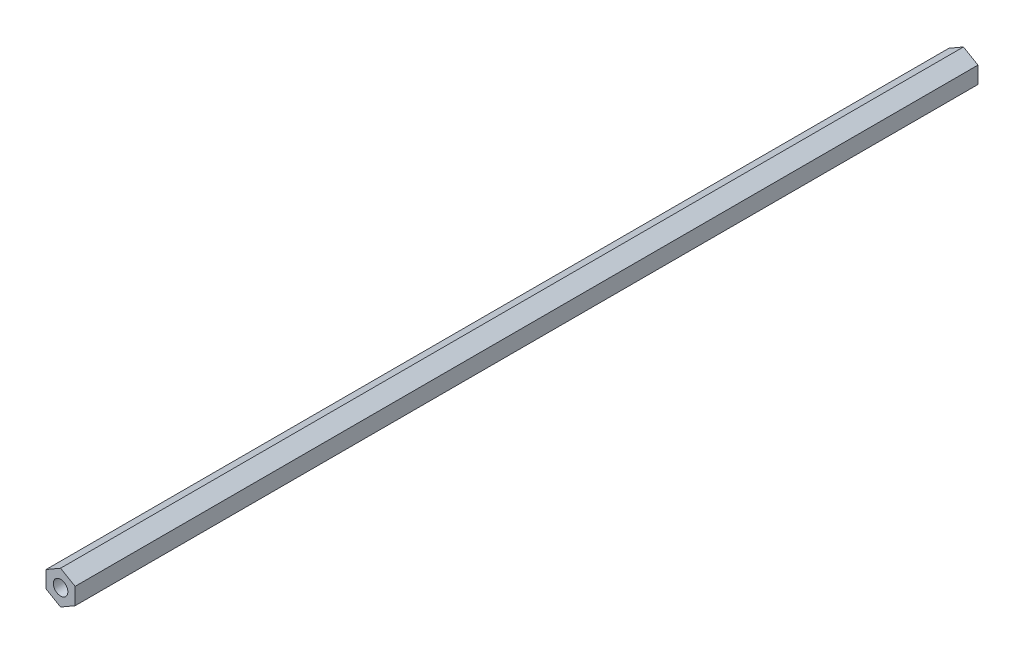
ISO-10303-21;
HEADER;
FILE_DESCRIPTION(('STEP AP214'),'2;1');
FILE_NAME('part.step','',(''),(''),'','','');
FILE_SCHEMA(('AUTOMOTIVE_DESIGN { 1 0 10303 214 1 1 1 1 }'));
ENDSEC;
DATA;
#1=APPLICATION_CONTEXT('core data for automotive mechanical design processes');
#2=APPLICATION_PROTOCOL_DEFINITION('international standard','automotive_design',2000,#1);
#3=PRODUCT_CONTEXT('',#1,'mechanical');
#4=PRODUCT('Part','Part','',(#3));
#5=PRODUCT_RELATED_PRODUCT_CATEGORY('part','',(#4));
#6=PRODUCT_DEFINITION_FORMATION('','',#4);
#7=PRODUCT_DEFINITION_CONTEXT('part definition',#1,'design');
#8=PRODUCT_DEFINITION('design','',#6,#7);
#9=PRODUCT_DEFINITION_SHAPE('','',#8);
#10=(LENGTH_UNIT() NAMED_UNIT(*) SI_UNIT(.MILLI.,.METRE.));
#11=(NAMED_UNIT(*) PLANE_ANGLE_UNIT() SI_UNIT($,.RADIAN.));
#12=(NAMED_UNIT(*) SI_UNIT($,.STERADIAN.) SOLID_ANGLE_UNIT());
#13=UNCERTAINTY_MEASURE_WITH_UNIT(LENGTH_MEASURE(1.E-05),#10,'distance_accuracy_value','');
#14=(GEOMETRIC_REPRESENTATION_CONTEXT(3) GLOBAL_UNCERTAINTY_ASSIGNED_CONTEXT((#13)) GLOBAL_UNIT_ASSIGNED_CONTEXT((#10,
#11,#12)) REPRESENTATION_CONTEXT('',''));
#15=CARTESIAN_POINT('',(0.,0.,0.));
#16=DIRECTION('',(0.,0.,1.));
#17=DIRECTION('',(1.,0.,0.));
#18=AXIS2_PLACEMENT_3D('',#15,#16,#17);
#19=CARTESIAN_POINT('',(-6.35,3.66617420935411,196.85));
#20=DIRECTION('',(1.,0.,0.));
#21=DIRECTION('',(0.,0.,-1.));
#22=AXIS2_PLACEMENT_3D('',#19,#20,#21);
#23=PLANE('',#22);
#24=DIRECTION('',(0.,0.,-1.));
#25=VECTOR('',#24,1.);
#26=CARTESIAN_POINT('',(-6.35,3.66617420935411,196.85));
#27=LINE('',#26,#25);
#28=CARTESIAN_POINT('',(-6.35,3.66617420935411,196.85));
#29=VERTEX_POINT('',#28);
#30=CARTESIAN_POINT('',(-6.35,3.66617420935411,-196.85));
#31=VERTEX_POINT('',#30);
#32=EDGE_CURVE('E142',#29,#31,#27,.T.);
#33=ORIENTED_EDGE('',*,*,#32,.T.);
#34=DIRECTION('',(0.,-1.,0.));
#35=VECTOR('',#34,1.);
#36=CARTESIAN_POINT('',(-6.35,3.66617420935411,-196.85));
#37=LINE('',#36,#35);
#38=CARTESIAN_POINT('',(-6.35,-3.66617420935413,-196.85));
#39=VERTEX_POINT('',#38);
#40=EDGE_CURVE('E114',#31,#39,#37,.T.);
#41=ORIENTED_EDGE('',*,*,#40,.T.);
#42=DIRECTION('',(0.,0.,-1.));
#43=VECTOR('',#42,1.);
#44=CARTESIAN_POINT('',(-6.35,-3.66617420935413,196.85));
#45=LINE('',#44,#43);
#46=CARTESIAN_POINT('',(-6.35,-3.66617420935413,196.85));
#47=VERTEX_POINT('',#46);
#48=EDGE_CURVE('E11',#47,#39,#45,.T.);
#49=ORIENTED_EDGE('',*,*,#48,.F.);
#50=DIRECTION('',(0.,-1.,0.));
#51=VECTOR('',#50,1.);
#52=CARTESIAN_POINT('',(-6.35,3.66617420935411,196.85));
#53=LINE('',#52,#51);
#54=EDGE_CURVE('E132',#29,#47,#53,.T.);
#55=ORIENTED_EDGE('',*,*,#54,.F.);
#56=EDGE_LOOP('',(#33,#41,#49,#55));
#57=FACE_BOUND('',#56,.T.);
#58=ADVANCED_FACE('F38',(#57),#23,.F.);
#59=CARTESIAN_POINT('',(-6.35,-3.66617420935413,196.85));
#60=DIRECTION('',(0.5,0.866025403784438,0.));
#61=DIRECTION('',(-0.866025403784439,0.5,0.));
#62=AXIS2_PLACEMENT_3D('',#59,#60,#61);
#63=PLANE('',#62);
#64=ORIENTED_EDGE('',*,*,#48,.T.);
#65=DIRECTION('',(0.866025403784439,-0.5,0.));
#66=VECTOR('',#65,1.);
#67=CARTESIAN_POINT('',(-6.35,-3.66617420935413,-196.85));
#68=LINE('',#67,#66);
#69=CARTESIAN_POINT('',(0.,-7.33234841870826,-196.85));
#70=VERTEX_POINT('',#69);
#71=EDGE_CURVE('E117',#39,#70,#68,.T.);
#72=ORIENTED_EDGE('',*,*,#71,.T.);
#73=DIRECTION('',(0.,0.,-1.));
#74=VECTOR('',#73,1.);
#75=CARTESIAN_POINT('',(0.,-7.33234841870826,196.85));
#76=LINE('',#75,#74);
#77=CARTESIAN_POINT('',(0.,-7.33234841870826,196.85));
#78=VERTEX_POINT('',#77);
#79=EDGE_CURVE('E45',#78,#70,#76,.T.);
#80=ORIENTED_EDGE('',*,*,#79,.F.);
#81=DIRECTION('',(0.866025403784439,-0.5,0.));
#82=VECTOR('',#81,1.);
#83=CARTESIAN_POINT('',(-6.35,-3.66617420935413,196.85));
#84=LINE('',#83,#82);
#85=EDGE_CURVE('E134',#47,#78,#84,.T.);
#86=ORIENTED_EDGE('',*,*,#85,.F.);
#87=EDGE_LOOP('',(#64,#72,#80,#86));
#88=FACE_BOUND('',#87,.T.);
#89=ADVANCED_FACE('F162',(#88),#63,.F.);
#90=CARTESIAN_POINT('',(0.,-7.33234841870826,196.85));
#91=DIRECTION('',(-0.5,0.866025403784439,0.));
#92=DIRECTION('',(-0.866025403784439,-0.5,0.));
#93=AXIS2_PLACEMENT_3D('',#90,#91,#92);
#94=PLANE('',#93);
#95=ORIENTED_EDGE('',*,*,#79,.T.);
#96=DIRECTION('',(0.866025403784439,0.5,0.));
#97=VECTOR('',#96,1.);
#98=CARTESIAN_POINT('',(0.,-7.33234841870826,-196.85));
#99=LINE('',#98,#97);
#100=CARTESIAN_POINT('',(6.35,-3.66617420935414,-196.85));
#101=VERTEX_POINT('',#100);
#102=EDGE_CURVE('E120',#70,#101,#99,.T.);
#103=ORIENTED_EDGE('',*,*,#102,.T.);
#104=DIRECTION('',(0.,0.,-1.));
#105=VECTOR('',#104,1.);
#106=CARTESIAN_POINT('',(6.35,-3.66617420935414,196.85));
#107=LINE('',#106,#105);
#108=CARTESIAN_POINT('',(6.35,-3.66617420935414,196.85));
#109=VERTEX_POINT('',#108);
#110=EDGE_CURVE('E148',#109,#101,#107,.T.);
#111=ORIENTED_EDGE('',*,*,#110,.F.);
#112=DIRECTION('',(0.866025403784439,0.5,0.));
#113=VECTOR('',#112,1.);
#114=CARTESIAN_POINT('',(0.,-7.33234841870826,196.85));
#115=LINE('',#114,#113);
#116=EDGE_CURVE('E136',#78,#109,#115,.T.);
#117=ORIENTED_EDGE('',*,*,#116,.F.);
#118=EDGE_LOOP('',(#95,#103,#111,#117));
#119=FACE_BOUND('',#118,.T.);
#120=ADVANCED_FACE('F153',(#119),#94,.F.);
#121=CARTESIAN_POINT('',(6.35,-3.66617420935414,196.85));
#122=DIRECTION('',(-1.,0.,0.));
#123=DIRECTION('',(0.,-1.,0.));
#124=AXIS2_PLACEMENT_3D('',#121,#122,#123);
#125=PLANE('',#124);
#126=ORIENTED_EDGE('',*,*,#110,.T.);
#127=DIRECTION('',(0.,1.,0.));
#128=VECTOR('',#127,1.);
#129=CARTESIAN_POINT('',(6.35,-3.66617420935414,-196.85));
#130=LINE('',#129,#128);
#131=CARTESIAN_POINT('',(6.35,3.66617420935412,-196.85));
#132=VERTEX_POINT('',#131);
#133=EDGE_CURVE('E123',#101,#132,#130,.T.);
#134=ORIENTED_EDGE('',*,*,#133,.T.);
#135=DIRECTION('',(0.,0.,-1.));
#136=VECTOR('',#135,1.);
#137=CARTESIAN_POINT('',(6.35,3.66617420935412,196.85));
#138=LINE('',#137,#136);
#139=CARTESIAN_POINT('',(6.35,3.66617420935412,196.85));
#140=VERTEX_POINT('',#139);
#141=EDGE_CURVE('E146',#140,#132,#138,.T.);
#142=ORIENTED_EDGE('',*,*,#141,.F.);
#143=DIRECTION('',(0.,1.,0.));
#144=VECTOR('',#143,1.);
#145=CARTESIAN_POINT('',(6.35,-3.66617420935414,196.85));
#146=LINE('',#145,#144);
#147=EDGE_CURVE('E138',#109,#140,#146,.T.);
#148=ORIENTED_EDGE('',*,*,#147,.F.);
#149=EDGE_LOOP('',(#126,#134,#142,#148));
#150=FACE_BOUND('',#149,.T.);
#151=ADVANCED_FACE('F173',(#150),#125,.F.);
#152=CARTESIAN_POINT('',(6.35,3.66617420935412,196.85));
#153=DIRECTION('',(-0.5,-0.866025403784438,0.));
#154=DIRECTION('',(0.866025403784439,-0.5,0.));
#155=AXIS2_PLACEMENT_3D('',#152,#153,#154);
#156=PLANE('',#155);
#157=ORIENTED_EDGE('',*,*,#141,.T.);
#158=DIRECTION('',(-0.866025403784439,0.5,0.));
#159=VECTOR('',#158,1.);
#160=CARTESIAN_POINT('',(6.35,3.66617420935412,-196.85));
#161=LINE('',#160,#159);
#162=CARTESIAN_POINT('',(0.,7.33234841870824,-196.85));
#163=VERTEX_POINT('',#162);
#164=EDGE_CURVE('E126',#132,#163,#161,.T.);
#165=ORIENTED_EDGE('',*,*,#164,.T.);
#166=DIRECTION('',(0.,0.,-1.));
#167=VECTOR('',#166,1.);
#168=CARTESIAN_POINT('',(0.,7.33234841870824,196.85));
#169=LINE('',#168,#167);
#170=CARTESIAN_POINT('',(0.,7.33234841870824,196.85));
#171=VERTEX_POINT('',#170);
#172=EDGE_CURVE('E144',#171,#163,#169,.T.);
#173=ORIENTED_EDGE('',*,*,#172,.F.);
#174=DIRECTION('',(-0.866025403784439,0.5,0.));
#175=VECTOR('',#174,1.);
#176=CARTESIAN_POINT('',(6.35,3.66617420935412,196.85));
#177=LINE('',#176,#175);
#178=EDGE_CURVE('E57',#140,#171,#177,.T.);
#179=ORIENTED_EDGE('',*,*,#178,.F.);
#180=EDGE_LOOP('',(#157,#165,#173,#179));
#181=FACE_BOUND('',#180,.T.);
#182=ADVANCED_FACE('F170',(#181),#156,.F.);
#183=CARTESIAN_POINT('',(0.,7.33234841870824,196.85));
#184=DIRECTION('',(0.5,-0.866025403784439,0.));
#185=DIRECTION('',(0.866025403784439,0.5,0.));
#186=AXIS2_PLACEMENT_3D('',#183,#184,#185);
#187=PLANE('',#186);
#188=ORIENTED_EDGE('',*,*,#172,.T.);
#189=DIRECTION('',(-0.866025403784439,-0.5,0.));
#190=VECTOR('',#189,1.);
#191=CARTESIAN_POINT('',(0.,7.33234841870824,-196.85));
#192=LINE('',#191,#190);
#193=EDGE_CURVE('E129',#163,#31,#192,.T.);
#194=ORIENTED_EDGE('',*,*,#193,.T.);
#195=ORIENTED_EDGE('',*,*,#32,.F.);
#196=DIRECTION('',(-0.866025403784439,-0.5,0.));
#197=VECTOR('',#196,1.);
#198=CARTESIAN_POINT('',(0.,7.33234841870824,196.85));
#199=LINE('',#198,#197);
#200=EDGE_CURVE('E52',#171,#29,#199,.T.);
#201=ORIENTED_EDGE('',*,*,#200,.F.);
#202=EDGE_LOOP('',(#188,#194,#195,#201));
#203=FACE_BOUND('',#202,.T.);
#204=ADVANCED_FACE('F168',(#203),#187,.F.);
#205=CARTESIAN_POINT('',(0.,0.,196.85));
#206=DIRECTION('',(0.,0.,1.));
#207=DIRECTION('',(1.,0.,0.));
#208=AXIS2_PLACEMENT_3D('',#205,#206,#207);
#209=PLANE('',#208);
#210=CARTESIAN_POINT('',(0.,0.,196.85));
#211=DIRECTION('',(0.,0.,1.));
#212=DIRECTION('',(1.,0.,0.));
#213=AXIS2_PLACEMENT_3D('',#210,#211,#212);
#214=CIRCLE('',#213,3.17499999999999);
#215=CARTESIAN_POINT('',(3.17499999999999,0.,196.85));
#216=VERTEX_POINT('',#215);
#217=EDGE_CURVE('E103',#216,#216,#214,.T.);
#218=ORIENTED_EDGE('',*,*,#217,.F.);
#219=EDGE_LOOP('',(#218));
#220=FACE_BOUND('',#219,.T.);
#221=ORIENTED_EDGE('',*,*,#54,.T.);
#222=ORIENTED_EDGE('',*,*,#85,.T.);
#223=ORIENTED_EDGE('',*,*,#116,.T.);
#224=ORIENTED_EDGE('',*,*,#147,.T.);
#225=ORIENTED_EDGE('',*,*,#178,.T.);
#226=ORIENTED_EDGE('',*,*,#200,.T.);
#227=EDGE_LOOP('',(#221,#222,#223,#224,#225,#226));
#228=FACE_BOUND('',#227,.T.);
#229=ADVANCED_FACE('F175',(#220,#228),#209,.T.);
#230=CARTESIAN_POINT('',(0.,0.,-196.85));
#231=DIRECTION('',(0.,0.,1.));
#232=DIRECTION('',(1.,0.,0.));
#233=AXIS2_PLACEMENT_3D('',#230,#231,#232);
#234=PLANE('',#233);
#235=CARTESIAN_POINT('',(0.,0.,-196.85));
#236=DIRECTION('',(0.,0.,-1.));
#237=DIRECTION('',(-1.,0.,0.));
#238=AXIS2_PLACEMENT_3D('',#235,#236,#237);
#239=CIRCLE('',#238,3.17499999999999);
#240=CARTESIAN_POINT('',(-3.17499999999999,0.,-196.85));
#241=VERTEX_POINT('',#240);
#242=EDGE_CURVE('E104',#241,#241,#239,.T.);
#243=ORIENTED_EDGE('',*,*,#242,.F.);
#244=EDGE_LOOP('',(#243));
#245=FACE_BOUND('',#244,.T.);
#246=ORIENTED_EDGE('',*,*,#40,.F.);
#247=ORIENTED_EDGE('',*,*,#193,.F.);
#248=ORIENTED_EDGE('',*,*,#164,.F.);
#249=ORIENTED_EDGE('',*,*,#133,.F.);
#250=ORIENTED_EDGE('',*,*,#102,.F.);
#251=ORIENTED_EDGE('',*,*,#71,.F.);
#252=EDGE_LOOP('',(#246,#247,#248,#249,#250,#251));
#253=FACE_BOUND('',#252,.T.);
#254=ADVANCED_FACE('F160',(#245,#253),#234,.F.);
#255=CARTESIAN_POINT('',(0.,0.,171.45));
#256=DIRECTION('',(0.,0.,1.));
#257=DIRECTION('',(1.,0.,0.));
#258=AXIS2_PLACEMENT_3D('',#255,#256,#257);
#259=CONICAL_SURFACE('',#258,3.17499999999995,1.02974425867665);
#260=CARTESIAN_POINT('',(0.,0.,169.542267534588));
#261=VERTEX_POINT('',#260);
#262=VERTEX_LOOP('',#261);
#263=FACE_BOUND('',#262,.T.);
#264=CARTESIAN_POINT('',(0.,0.,171.45));
#265=DIRECTION('',(0.,0.,1.));
#266=DIRECTION('',(1.,0.,0.));
#267=AXIS2_PLACEMENT_3D('',#264,#265,#266);
#268=CIRCLE('',#267,3.17499999999995);
#269=CARTESIAN_POINT('',(3.17499999999995,0.,171.45));
#270=VERTEX_POINT('',#269);
#271=EDGE_CURVE('E107',#270,#270,#268,.T.);
#272=ORIENTED_EDGE('',*,*,#271,.T.);
#273=EDGE_LOOP('',(#272));
#274=FACE_BOUND('',#273,.T.);
#275=ADVANCED_FACE('F183',(#263,#274),#259,.F.);
#276=CARTESIAN_POINT('',(0.,0.,196.85));
#277=DIRECTION('',(0.,0.,1.));
#278=DIRECTION('',(1.,0.,0.));
#279=AXIS2_PLACEMENT_3D('',#276,#277,#278);
#280=CYLINDRICAL_SURFACE('',#279,3.17499999999997);
#281=ORIENTED_EDGE('',*,*,#271,.F.);
#282=EDGE_LOOP('',(#281));
#283=FACE_BOUND('',#282,.T.);
#284=ORIENTED_EDGE('',*,*,#217,.T.);
#285=EDGE_LOOP('',(#284));
#286=FACE_BOUND('',#285,.T.);
#287=ADVANCED_FACE('F97',(#283,#286),#280,.F.);
#288=CARTESIAN_POINT('',(0.,0.,-171.45));
#289=DIRECTION('',(0.,0.,-1.));
#290=DIRECTION('',(-1.,0.,0.));
#291=AXIS2_PLACEMENT_3D('',#288,#289,#290);
#292=CONICAL_SURFACE('',#291,3.17499999999995,1.02974425867665);
#293=CARTESIAN_POINT('',(0.,0.,-169.542267534588));
#294=VERTEX_POINT('',#293);
#295=VERTEX_LOOP('',#294);
#296=FACE_BOUND('',#295,.T.);
#297=CARTESIAN_POINT('',(0.,0.,-171.45));
#298=DIRECTION('',(0.,0.,-1.));
#299=DIRECTION('',(-1.,0.,0.));
#300=AXIS2_PLACEMENT_3D('',#297,#298,#299);
#301=CIRCLE('',#300,3.17499999999995);
#302=CARTESIAN_POINT('',(-3.17499999999995,0.,-171.45));
#303=VERTEX_POINT('',#302);
#304=EDGE_CURVE('E101',#303,#303,#301,.T.);
#305=ORIENTED_EDGE('',*,*,#304,.T.);
#306=EDGE_LOOP('',(#305));
#307=FACE_BOUND('',#306,.T.);
#308=ADVANCED_FACE('F93',(#296,#307),#292,.F.);
#309=CARTESIAN_POINT('',(0.,0.,-196.85));
#310=DIRECTION('',(0.,0.,-1.));
#311=DIRECTION('',(-1.,0.,0.));
#312=AXIS2_PLACEMENT_3D('',#309,#310,#311);
#313=CYLINDRICAL_SURFACE('',#312,3.17499999999997);
#314=ORIENTED_EDGE('',*,*,#304,.F.);
#315=EDGE_LOOP('',(#314));
#316=FACE_BOUND('',#315,.T.);
#317=ORIENTED_EDGE('',*,*,#242,.T.);
#318=EDGE_LOOP('',(#317));
#319=FACE_BOUND('',#318,.T.);
#320=ADVANCED_FACE('F96',(#316,#319),#313,.F.);
#321=CLOSED_SHELL('',(#58,#89,#120,#151,#182,#204,#229,#254,#275,#287,#308,#320));
#322=MANIFOLD_SOLID_BREP('B2',#321);
#323=ADVANCED_BREP_SHAPE_REPRESENTATION('',(#18,#322),#14);
#324=SHAPE_DEFINITION_REPRESENTATION(#9,#323);
ENDSEC;
END-ISO-10303-21;
